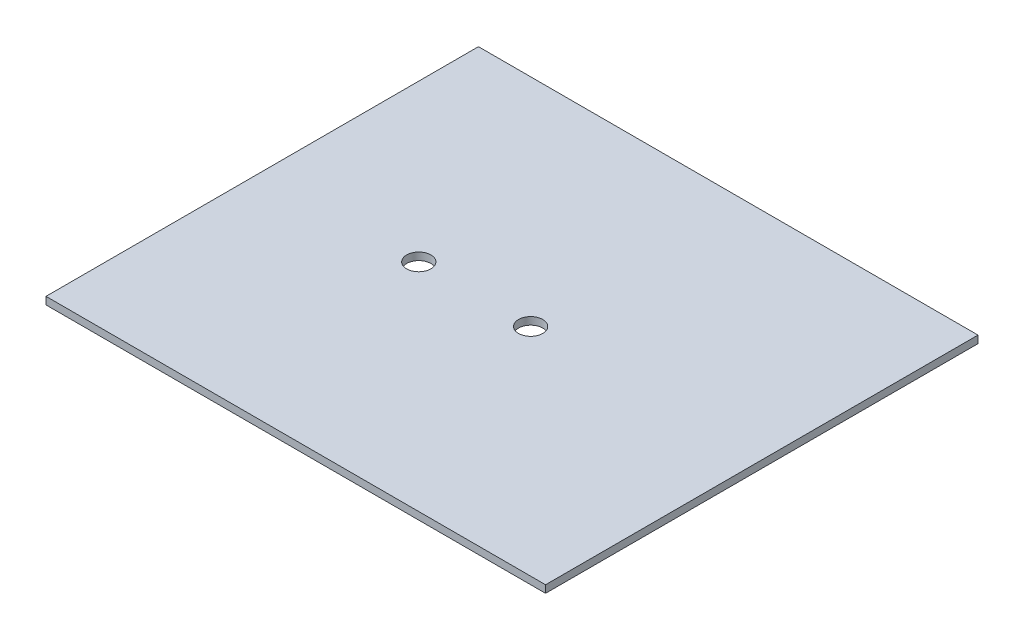
ISO-10303-21;
HEADER;
FILE_DESCRIPTION(('STEP AP214'),'2;1');
FILE_NAME('part.step','',(''),(''),'','','');
FILE_SCHEMA(('AUTOMOTIVE_DESIGN { 1 0 10303 214 1 1 1 1 }'));
ENDSEC;
DATA;
#1=APPLICATION_CONTEXT('core data for automotive mechanical design processes');
#2=APPLICATION_PROTOCOL_DEFINITION('international standard','automotive_design',2000,#1);
#3=PRODUCT_CONTEXT('',#1,'mechanical');
#4=PRODUCT('Part','Part','',(#3));
#5=PRODUCT_RELATED_PRODUCT_CATEGORY('part','',(#4));
#6=PRODUCT_DEFINITION_FORMATION('','',#4);
#7=PRODUCT_DEFINITION_CONTEXT('part definition',#1,'design');
#8=PRODUCT_DEFINITION('design','',#6,#7);
#9=PRODUCT_DEFINITION_SHAPE('','',#8);
#10=(LENGTH_UNIT() NAMED_UNIT(*) SI_UNIT(.MILLI.,.METRE.));
#11=(NAMED_UNIT(*) PLANE_ANGLE_UNIT() SI_UNIT($,.RADIAN.));
#12=(NAMED_UNIT(*) SI_UNIT($,.STERADIAN.) SOLID_ANGLE_UNIT());
#13=UNCERTAINTY_MEASURE_WITH_UNIT(LENGTH_MEASURE(1.E-05),#10,'distance_accuracy_value','');
#14=(GEOMETRIC_REPRESENTATION_CONTEXT(3) GLOBAL_UNCERTAINTY_ASSIGNED_CONTEXT((#13)) GLOBAL_UNIT_ASSIGNED_CONTEXT((#10,
#11,#12)) REPRESENTATION_CONTEXT('',''));
#15=CARTESIAN_POINT('',(0.,0.,0.));
#16=DIRECTION('',(0.,0.,1.));
#17=DIRECTION('',(1.,0.,0.));
#18=AXIS2_PLACEMENT_3D('',#15,#16,#17);
#19=CARTESIAN_POINT('',(-72.5,2.,-58.));
#20=DIRECTION('',(0.,0.,-1.));
#21=DIRECTION('',(-1.,0.,0.));
#22=AXIS2_PLACEMENT_3D('',#19,#20,#21);
#23=PLANE('',#22);
#24=DIRECTION('',(1.,0.,0.));
#25=VECTOR('',#24,1.);
#26=CARTESIAN_POINT('',(-72.5,0.,-58.));
#27=LINE('',#26,#25);
#28=CARTESIAN_POINT('',(-62.5,0.,-58.));
#29=VERTEX_POINT('',#28);
#30=CARTESIAN_POINT('',(71.5,0.,-58.));
#31=VERTEX_POINT('',#30);
#32=EDGE_CURVE('E82',#29,#31,#27,.T.);
#33=ORIENTED_EDGE('',*,*,#32,.F.);
#34=DIRECTION('',(0.,-1.,0.));
#35=VECTOR('',#34,1.);
#36=CARTESIAN_POINT('',(-62.5,2.,-58.));
#37=LINE('',#36,#35);
#38=CARTESIAN_POINT('',(-62.5,2.,-58.));
#39=VERTEX_POINT('',#38);
#40=EDGE_CURVE('E36',#39,#29,#37,.T.);
#41=ORIENTED_EDGE('',*,*,#40,.F.);
#42=DIRECTION('',(1.,0.,0.));
#43=VECTOR('',#42,1.);
#44=CARTESIAN_POINT('',(-72.5,2.,-58.));
#45=LINE('',#44,#43);
#46=CARTESIAN_POINT('',(71.5,2.,-58.));
#47=VERTEX_POINT('',#46);
#48=EDGE_CURVE('E73',#39,#47,#45,.T.);
#49=ORIENTED_EDGE('',*,*,#48,.T.);
#50=DIRECTION('',(0.,-1.,0.));
#51=VECTOR('',#50,1.);
#52=CARTESIAN_POINT('',(71.5,2.,-58.));
#53=LINE('',#52,#51);
#54=EDGE_CURVE('E11',#47,#31,#53,.T.);
#55=ORIENTED_EDGE('',*,*,#54,.T.);
#56=EDGE_LOOP('',(#33,#41,#49,#55));
#57=FACE_BOUND('',#56,.T.);
#58=ADVANCED_FACE('F17',(#57),#23,.T.);
#59=CARTESIAN_POINT('',(71.5,2.,-58.));
#60=DIRECTION('',(1.,0.,0.));
#61=DIRECTION('',(0.,0.,-1.));
#62=AXIS2_PLACEMENT_3D('',#59,#60,#61);
#63=PLANE('',#62);
#64=DIRECTION('',(0.,0.,1.));
#65=VECTOR('',#64,1.);
#66=CARTESIAN_POINT('',(71.5,0.,-58.));
#67=LINE('',#66,#65);
#68=CARTESIAN_POINT('',(71.5,0.,58.));
#69=VERTEX_POINT('',#68);
#70=EDGE_CURVE('E76',#31,#69,#67,.T.);
#71=ORIENTED_EDGE('',*,*,#70,.F.);
#72=ORIENTED_EDGE('',*,*,#54,.F.);
#73=DIRECTION('',(0.,0.,1.));
#74=VECTOR('',#73,1.);
#75=CARTESIAN_POINT('',(71.5,2.,-58.));
#76=LINE('',#75,#74);
#77=CARTESIAN_POINT('',(71.5,2.,58.));
#78=VERTEX_POINT('',#77);
#79=EDGE_CURVE('E91',#47,#78,#76,.T.);
#80=ORIENTED_EDGE('',*,*,#79,.T.);
#81=DIRECTION('',(0.,-1.,0.));
#82=VECTOR('',#81,1.);
#83=CARTESIAN_POINT('',(71.5,2.,58.));
#84=LINE('',#83,#82);
#85=EDGE_CURVE('E27',#78,#69,#84,.T.);
#86=ORIENTED_EDGE('',*,*,#85,.T.);
#87=EDGE_LOOP('',(#71,#72,#80,#86));
#88=FACE_BOUND('',#87,.T.);
#89=ADVANCED_FACE('F111',(#88),#63,.T.);
#90=CARTESIAN_POINT('',(72.5,2.,58.));
#91=DIRECTION('',(0.,0.,1.));
#92=DIRECTION('',(1.,0.,0.));
#93=AXIS2_PLACEMENT_3D('',#90,#91,#92);
#94=PLANE('',#93);
#95=DIRECTION('',(-1.,0.,0.));
#96=VECTOR('',#95,1.);
#97=CARTESIAN_POINT('',(72.5,0.,58.));
#98=LINE('',#97,#96);
#99=CARTESIAN_POINT('',(-62.5,0.,58.));
#100=VERTEX_POINT('',#99);
#101=EDGE_CURVE('E62',#69,#100,#98,.T.);
#102=ORIENTED_EDGE('',*,*,#101,.F.);
#103=ORIENTED_EDGE('',*,*,#85,.F.);
#104=DIRECTION('',(-1.,0.,0.));
#105=VECTOR('',#104,1.);
#106=CARTESIAN_POINT('',(72.5,2.,58.));
#107=LINE('',#106,#105);
#108=CARTESIAN_POINT('',(-62.5,2.,58.));
#109=VERTEX_POINT('',#108);
#110=EDGE_CURVE('E65',#78,#109,#107,.T.);
#111=ORIENTED_EDGE('',*,*,#110,.T.);
#112=DIRECTION('',(0.,-1.,0.));
#113=VECTOR('',#112,1.);
#114=CARTESIAN_POINT('',(-62.5,2.,58.));
#115=LINE('',#114,#113);
#116=EDGE_CURVE('E21',#109,#100,#115,.T.);
#117=ORIENTED_EDGE('',*,*,#116,.T.);
#118=EDGE_LOOP('',(#102,#103,#111,#117));
#119=FACE_BOUND('',#118,.T.);
#120=ADVANCED_FACE('F60',(#119),#94,.T.);
#121=CARTESIAN_POINT('',(-62.5,2.,58.));
#122=DIRECTION('',(-1.,0.,0.));
#123=DIRECTION('',(0.,0.,1.));
#124=AXIS2_PLACEMENT_3D('',#121,#122,#123);
#125=PLANE('',#124);
#126=DIRECTION('',(0.,0.,-1.));
#127=VECTOR('',#126,1.);
#128=CARTESIAN_POINT('',(-62.5,0.,58.));
#129=LINE('',#128,#127);
#130=EDGE_CURVE('E69',#100,#29,#129,.T.);
#131=ORIENTED_EDGE('',*,*,#130,.F.);
#132=ORIENTED_EDGE('',*,*,#116,.F.);
#133=DIRECTION('',(0.,0.,-1.));
#134=VECTOR('',#133,1.);
#135=CARTESIAN_POINT('',(-62.5,2.,58.));
#136=LINE('',#135,#134);
#137=EDGE_CURVE('E106',#109,#39,#136,.T.);
#138=ORIENTED_EDGE('',*,*,#137,.T.);
#139=ORIENTED_EDGE('',*,*,#40,.T.);
#140=EDGE_LOOP('',(#131,#132,#138,#139));
#141=FACE_BOUND('',#140,.T.);
#142=ADVANCED_FACE('F19',(#141),#125,.T.);
#143=CARTESIAN_POINT('',(0.,2.,0.));
#144=DIRECTION('',(0.,-1.,0.));
#145=DIRECTION('',(0.,0.,-1.));
#146=AXIS2_PLACEMENT_3D('',#143,#144,#145);
#147=PLANE('',#146);
#148=CARTESIAN_POINT('',(9.5,2.,0.));
#149=DIRECTION('',(0.,-1.,0.));
#150=DIRECTION('',(0.,0.,-1.));
#151=AXIS2_PLACEMENT_3D('',#148,#149,#150);
#152=CIRCLE('',#151,3.25);
#153=CARTESIAN_POINT('',(9.5,2.,-3.25000000000001));
#154=VERTEX_POINT('',#153);
#155=EDGE_CURVE('E97',#154,#154,#152,.F.);
#156=ORIENTED_EDGE('',*,*,#155,.F.);
#157=EDGE_LOOP('',(#156));
#158=FACE_BOUND('',#157,.T.);
#159=CARTESIAN_POINT('',(-20.5,2.,0.));
#160=DIRECTION('',(0.,-1.,0.));
#161=DIRECTION('',(0.,0.,-1.));
#162=AXIS2_PLACEMENT_3D('',#159,#160,#161);
#163=CIRCLE('',#162,3.25);
#164=CARTESIAN_POINT('',(-20.5,2.,-3.25000000000001));
#165=VERTEX_POINT('',#164);
#166=EDGE_CURVE('E88',#165,#165,#163,.F.);
#167=ORIENTED_EDGE('',*,*,#166,.F.);
#168=EDGE_LOOP('',(#167));
#169=FACE_BOUND('',#168,.T.);
#170=ORIENTED_EDGE('',*,*,#48,.F.);
#171=ORIENTED_EDGE('',*,*,#137,.F.);
#172=ORIENTED_EDGE('',*,*,#110,.F.);
#173=ORIENTED_EDGE('',*,*,#79,.F.);
#174=EDGE_LOOP('',(#170,#171,#172,#173));
#175=FACE_BOUND('',#174,.T.);
#176=ADVANCED_FACE('F110',(#158,#169,#175),#147,.F.);
#177=CARTESIAN_POINT('',(0.,0.,0.));
#178=DIRECTION('',(0.,-1.,0.));
#179=DIRECTION('',(0.,0.,-1.));
#180=AXIS2_PLACEMENT_3D('',#177,#178,#179);
#181=PLANE('',#180);
#182=CARTESIAN_POINT('',(9.5,0.,0.));
#183=DIRECTION('',(0.,1.,0.));
#184=DIRECTION('',(-1.,0.,0.));
#185=AXIS2_PLACEMENT_3D('',#182,#183,#184);
#186=CIRCLE('',#185,3.25);
#187=CARTESIAN_POINT('',(6.25,0.,0.));
#188=VERTEX_POINT('',#187);
#189=EDGE_CURVE('E100',#188,#188,#186,.T.);
#190=ORIENTED_EDGE('',*,*,#189,.T.);
#191=EDGE_LOOP('',(#190));
#192=FACE_BOUND('',#191,.T.);
#193=CARTESIAN_POINT('',(-20.5,0.,0.));
#194=DIRECTION('',(0.,1.,0.));
#195=DIRECTION('',(-1.,0.,0.));
#196=AXIS2_PLACEMENT_3D('',#193,#194,#195);
#197=CIRCLE('',#196,3.25);
#198=CARTESIAN_POINT('',(-23.75,0.,0.));
#199=VERTEX_POINT('',#198);
#200=EDGE_CURVE('E93',#199,#199,#197,.T.);
#201=ORIENTED_EDGE('',*,*,#200,.T.);
#202=EDGE_LOOP('',(#201));
#203=FACE_BOUND('',#202,.T.);
#204=ORIENTED_EDGE('',*,*,#32,.T.);
#205=ORIENTED_EDGE('',*,*,#70,.T.);
#206=ORIENTED_EDGE('',*,*,#101,.T.);
#207=ORIENTED_EDGE('',*,*,#130,.T.);
#208=EDGE_LOOP('',(#204,#205,#206,#207));
#209=FACE_BOUND('',#208,.T.);
#210=ADVANCED_FACE('F75',(#192,#203,#209),#181,.T.);
#211=CARTESIAN_POINT('',(-20.5,17.2692487093251,0.));
#212=DIRECTION('',(0.,-1.,0.));
#213=DIRECTION('',(0.,0.,-1.));
#214=AXIS2_PLACEMENT_3D('',#211,#212,#213);
#215=CYLINDRICAL_SURFACE('',#214,3.25);
#216=ORIENTED_EDGE('',*,*,#200,.F.);
#217=EDGE_LOOP('',(#216));
#218=FACE_BOUND('',#217,.T.);
#219=ORIENTED_EDGE('',*,*,#166,.T.);
#220=EDGE_LOOP('',(#219));
#221=FACE_BOUND('',#220,.T.);
#222=ADVANCED_FACE('F122',(#218,#221),#215,.F.);
#223=CARTESIAN_POINT('',(9.5,17.2692487093251,0.));
#224=DIRECTION('',(0.,-1.,0.));
#225=DIRECTION('',(0.,0.,-1.));
#226=AXIS2_PLACEMENT_3D('',#223,#224,#225);
#227=CYLINDRICAL_SURFACE('',#226,3.25);
#228=ORIENTED_EDGE('',*,*,#189,.F.);
#229=EDGE_LOOP('',(#228));
#230=FACE_BOUND('',#229,.T.);
#231=ORIENTED_EDGE('',*,*,#155,.T.);
#232=EDGE_LOOP('',(#231));
#233=FACE_BOUND('',#232,.T.);
#234=ADVANCED_FACE('F124',(#230,#233),#227,.F.);
#235=CLOSED_SHELL('',(#58,#89,#120,#142,#176,#210,#222,#234));
#236=MANIFOLD_SOLID_BREP('B1',#235);
#237=ADVANCED_BREP_SHAPE_REPRESENTATION('',(#18,#236),#14);
#238=SHAPE_DEFINITION_REPRESENTATION(#9,#237);
ENDSEC;
END-ISO-10303-21;
